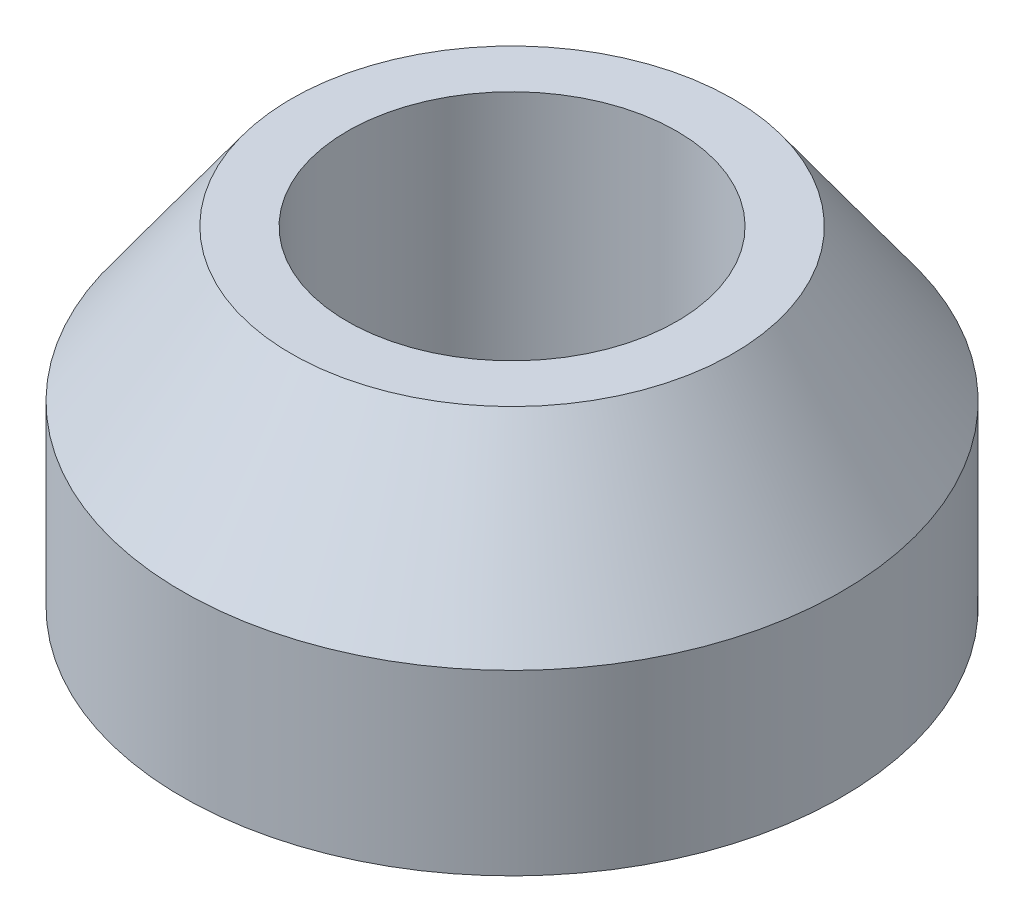
ISO-10303-21;
HEADER;
FILE_DESCRIPTION(('STEP AP214'),'2;1');
FILE_NAME('part.step','',(''),(''),'','','');
FILE_SCHEMA(('AUTOMOTIVE_DESIGN { 1 0 10303 214 1 1 1 1 }'));
ENDSEC;
DATA;
#1=APPLICATION_CONTEXT('core data for automotive mechanical design processes');
#2=APPLICATION_PROTOCOL_DEFINITION('international standard','automotive_design',2000,#1);
#3=PRODUCT_CONTEXT('',#1,'mechanical');
#4=PRODUCT('Part','Part','',(#3));
#5=PRODUCT_RELATED_PRODUCT_CATEGORY('part','',(#4));
#6=PRODUCT_DEFINITION_FORMATION('','',#4);
#7=PRODUCT_DEFINITION_CONTEXT('part definition',#1,'design');
#8=PRODUCT_DEFINITION('design','',#6,#7);
#9=PRODUCT_DEFINITION_SHAPE('','',#8);
#10=(LENGTH_UNIT() NAMED_UNIT(*) SI_UNIT(.MILLI.,.METRE.));
#11=(NAMED_UNIT(*) PLANE_ANGLE_UNIT() SI_UNIT($,.RADIAN.));
#12=(NAMED_UNIT(*) SI_UNIT($,.STERADIAN.) SOLID_ANGLE_UNIT());
#13=UNCERTAINTY_MEASURE_WITH_UNIT(LENGTH_MEASURE(1.E-05),#10,'distance_accuracy_value','');
#14=(GEOMETRIC_REPRESENTATION_CONTEXT(3) GLOBAL_UNCERTAINTY_ASSIGNED_CONTEXT((#13)) GLOBAL_UNIT_ASSIGNED_CONTEXT((#10,
#11,#12)) REPRESENTATION_CONTEXT('',''));
#15=CARTESIAN_POINT('',(0.,0.,0.));
#16=DIRECTION('',(0.,0.,1.));
#17=DIRECTION('',(1.,0.,0.));
#18=AXIS2_PLACEMENT_3D('',#15,#16,#17);
#19=CARTESIAN_POINT('',(0.,0.,-6.35));
#20=DIRECTION('',(0.,-1.,0.));
#21=DIRECTION('',(0.,0.,-1.));
#22=AXIS2_PLACEMENT_3D('',#19,#20,#21);
#23=PLANE('',#22);
#24=CARTESIAN_POINT('',(0.,0.,0.));
#25=DIRECTION('',(0.,-1.,0.));
#26=DIRECTION('',(0.,0.,-1.));
#27=AXIS2_PLACEMENT_3D('',#24,#25,#26);
#28=CIRCLE('',#27,6.35);
#29=CARTESIAN_POINT('',(0.,0.,-6.35));
#30=VERTEX_POINT('',#29);
#31=EDGE_CURVE('E66',#30,#30,#28,.T.);
#32=ORIENTED_EDGE('',*,*,#31,.T.);
#33=EDGE_LOOP('',(#32));
#34=FACE_BOUND('',#33,.T.);
#35=CARTESIAN_POINT('',(0.,0.,0.));
#36=DIRECTION('',(0.,-1.,0.));
#37=DIRECTION('',(0.,0.,-1.));
#38=AXIS2_PLACEMENT_3D('',#35,#36,#37);
#39=CIRCLE('',#38,3.175);
#40=CARTESIAN_POINT('',(0.,0.,-3.175));
#41=VERTEX_POINT('',#40);
#42=EDGE_CURVE('E10',#41,#41,#39,.T.);
#43=ORIENTED_EDGE('',*,*,#42,.F.);
#44=EDGE_LOOP('',(#43));
#45=FACE_BOUND('',#44,.T.);
#46=ADVANCED_FACE('F43',(#34,#45),#23,.T.);
#47=CARTESIAN_POINT('',(0.,0.,0.));
#48=DIRECTION('',(0.,-1.,0.));
#49=DIRECTION('',(0.,0.,-1.));
#50=AXIS2_PLACEMENT_3D('',#47,#48,#49);
#51=CYLINDRICAL_SURFACE('',#50,3.175);
#52=ORIENTED_EDGE('',*,*,#42,.T.);
#53=EDGE_LOOP('',(#52));
#54=FACE_BOUND('',#53,.T.);
#55=CARTESIAN_POINT('',(0.,6.35,0.));
#56=DIRECTION('',(0.,-1.,0.));
#57=DIRECTION('',(0.,0.,-1.));
#58=AXIS2_PLACEMENT_3D('',#55,#56,#57);
#59=CIRCLE('',#58,3.175);
#60=CARTESIAN_POINT('',(0.,6.35,-3.175));
#61=VERTEX_POINT('',#60);
#62=EDGE_CURVE('E50',#61,#61,#59,.T.);
#63=ORIENTED_EDGE('',*,*,#62,.F.);
#64=EDGE_LOOP('',(#63));
#65=FACE_BOUND('',#64,.T.);
#66=ADVANCED_FACE('F85',(#54,#65),#51,.F.);
#67=CARTESIAN_POINT('',(0.,6.35,-3.175));
#68=DIRECTION('',(0.,1.,0.));
#69=DIRECTION('',(0.,0.,1.));
#70=AXIS2_PLACEMENT_3D('',#67,#68,#69);
#71=PLANE('',#70);
#72=ORIENTED_EDGE('',*,*,#62,.T.);
#73=EDGE_LOOP('',(#72));
#74=FACE_BOUND('',#73,.T.);
#75=CARTESIAN_POINT('',(0.,6.35,0.));
#76=DIRECTION('',(0.,-1.,0.));
#77=DIRECTION('',(0.,0.,-1.));
#78=AXIS2_PLACEMENT_3D('',#75,#76,#77);
#79=CIRCLE('',#78,4.2545);
#80=CARTESIAN_POINT('',(0.,6.35,-4.2545));
#81=VERTEX_POINT('',#80);
#82=EDGE_CURVE('E55',#81,#81,#79,.T.);
#83=ORIENTED_EDGE('',*,*,#82,.F.);
#84=EDGE_LOOP('',(#83));
#85=FACE_BOUND('',#84,.T.);
#86=ADVANCED_FACE('F81',(#74,#85),#71,.T.);
#87=CARTESIAN_POINT('',(0.,3.429,0.));
#88=DIRECTION('',(0.,-1.,0.));
#89=DIRECTION('',(0.,0.,-1.));
#90=AXIS2_PLACEMENT_3D('',#87,#88,#89);
#91=CONICAL_SURFACE('',#90,6.35,0.622302871187208);
#92=ORIENTED_EDGE('',*,*,#82,.T.);
#93=EDGE_LOOP('',(#92));
#94=FACE_BOUND('',#93,.T.);
#95=CARTESIAN_POINT('',(0.,3.429,0.));
#96=DIRECTION('',(0.,-1.,0.));
#97=DIRECTION('',(0.,0.,-1.));
#98=AXIS2_PLACEMENT_3D('',#95,#96,#97);
#99=CIRCLE('',#98,6.35);
#100=CARTESIAN_POINT('',(0.,3.429,-6.35));
#101=VERTEX_POINT('',#100);
#102=EDGE_CURVE('E60',#101,#101,#99,.T.);
#103=ORIENTED_EDGE('',*,*,#102,.F.);
#104=EDGE_LOOP('',(#103));
#105=FACE_BOUND('',#104,.T.);
#106=ADVANCED_FACE('F75',(#94,#105),#91,.T.);
#107=CARTESIAN_POINT('',(0.,0.,0.));
#108=DIRECTION('',(0.,-1.,0.));
#109=DIRECTION('',(0.,0.,-1.));
#110=AXIS2_PLACEMENT_3D('',#107,#108,#109);
#111=CYLINDRICAL_SURFACE('',#110,6.35);
#112=ORIENTED_EDGE('',*,*,#102,.T.);
#113=EDGE_LOOP('',(#112));
#114=FACE_BOUND('',#113,.T.);
#115=ORIENTED_EDGE('',*,*,#31,.F.);
#116=EDGE_LOOP('',(#115));
#117=FACE_BOUND('',#116,.T.);
#118=ADVANCED_FACE('F73',(#114,#117),#111,.T.);
#119=CLOSED_SHELL('',(#46,#66,#86,#106,#118));
#120=MANIFOLD_SOLID_BREP('B2',#119);
#121=ADVANCED_BREP_SHAPE_REPRESENTATION('',(#18,#120),#14);
#122=SHAPE_DEFINITION_REPRESENTATION(#9,#121);
ENDSEC;
END-ISO-10303-21;
